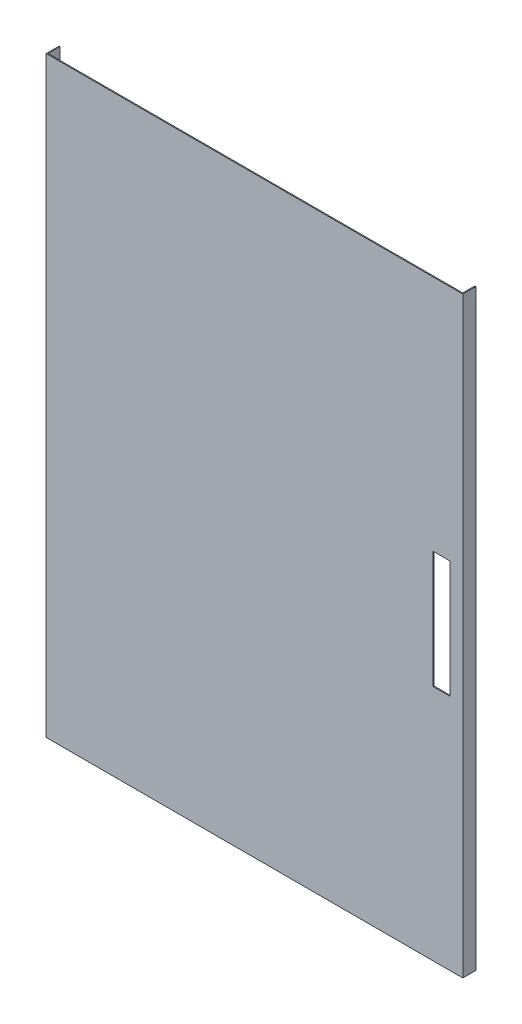
ISO-10303-21;
HEADER;
FILE_DESCRIPTION(('STEP AP214'),'2;1');
FILE_NAME('part.step','',(''),(''),'','','');
FILE_SCHEMA(('AUTOMOTIVE_DESIGN { 1 0 10303 214 1 1 1 1 }'));
ENDSEC;
DATA;
#1=APPLICATION_CONTEXT('core data for automotive mechanical design processes');
#2=APPLICATION_PROTOCOL_DEFINITION('international standard','automotive_design',2000,#1);
#3=PRODUCT_CONTEXT('',#1,'mechanical');
#4=PRODUCT('Part','Part','',(#3));
#5=PRODUCT_RELATED_PRODUCT_CATEGORY('part','',(#4));
#6=PRODUCT_DEFINITION_FORMATION('','',#4);
#7=PRODUCT_DEFINITION_CONTEXT('part definition',#1,'design');
#8=PRODUCT_DEFINITION('design','',#6,#7);
#9=PRODUCT_DEFINITION_SHAPE('','',#8);
#10=(LENGTH_UNIT() NAMED_UNIT(*) SI_UNIT(.MILLI.,.METRE.));
#11=(NAMED_UNIT(*) PLANE_ANGLE_UNIT() SI_UNIT($,.RADIAN.));
#12=(NAMED_UNIT(*) SI_UNIT($,.STERADIAN.) SOLID_ANGLE_UNIT());
#13=UNCERTAINTY_MEASURE_WITH_UNIT(LENGTH_MEASURE(1.E-05),#10,'distance_accuracy_value','');
#14=(GEOMETRIC_REPRESENTATION_CONTEXT(3) GLOBAL_UNCERTAINTY_ASSIGNED_CONTEXT((#13)) GLOBAL_UNIT_ASSIGNED_CONTEXT((#10,
#11,#12)) REPRESENTATION_CONTEXT('',''));
#15=CARTESIAN_POINT('',(0.,0.,0.));
#16=DIRECTION('',(0.,0.,1.));
#17=DIRECTION('',(1.,0.,0.));
#18=AXIS2_PLACEMENT_3D('',#15,#16,#17);
#19=CARTESIAN_POINT('',(670.,1950.,40.));
#20=DIRECTION('',(0.,0.,-1.));
#21=DIRECTION('',(-1.,0.,0.));
#22=AXIS2_PLACEMENT_3D('',#19,#20,#21);
#23=PLANE('',#22);
#24=DIRECTION('',(1.,0.,0.));
#25=VECTOR('',#24,1.);
#26=CARTESIAN_POINT('',(670.,1040.,40.));
#27=LINE('',#26,#25);
#28=CARTESIAN_POINT('',(30.,1040.,40.));
#29=VERTEX_POINT('',#28);
#30=CARTESIAN_POINT('',(670.,1040.,40.));
#31=VERTEX_POINT('',#30);
#32=EDGE_CURVE('E141',#29,#31,#27,.T.);
#33=ORIENTED_EDGE('',*,*,#32,.T.);
#34=DIRECTION('',(0.,-1.,0.));
#35=VECTOR('',#34,1.);
#36=CARTESIAN_POINT('',(670.,1950.,40.));
#37=LINE('',#36,#35);
#38=CARTESIAN_POINT('',(670.,1950.,40.));
#39=VERTEX_POINT('',#38);
#40=EDGE_CURVE('E200',#39,#31,#37,.T.);
#41=ORIENTED_EDGE('',*,*,#40,.F.);
#42=DIRECTION('',(1.,0.,0.));
#43=VECTOR('',#42,1.);
#44=CARTESIAN_POINT('',(670.,1950.,40.));
#45=LINE('',#44,#43);
#46=CARTESIAN_POINT('',(30.,1950.,40.));
#47=VERTEX_POINT('',#46);
#48=EDGE_CURVE('E149',#47,#39,#45,.T.);
#49=ORIENTED_EDGE('',*,*,#48,.F.);
#50=DIRECTION('',(0.,-1.,0.));
#51=VECTOR('',#50,1.);
#52=CARTESIAN_POINT('',(30.,1950.,40.));
#53=LINE('',#52,#51);
#54=EDGE_CURVE('E166',#47,#29,#53,.T.);
#55=ORIENTED_EDGE('',*,*,#54,.T.);
#56=EDGE_LOOP('',(#33,#41,#49,#55));
#57=FACE_BOUND('',#56,.T.);
#58=DIRECTION('',(0.,-1.,0.));
#59=VECTOR('',#58,1.);
#60=CARTESIAN_POINT('',(624.,1950.,40.));
#61=LINE('',#60,#59);
#62=CARTESIAN_POINT('',(624.,1585.,40.));
#63=VERTEX_POINT('',#62);
#64=CARTESIAN_POINT('',(624.,1405.,40.));
#65=VERTEX_POINT('',#64);
#66=EDGE_CURVE('E134',#63,#65,#61,.T.);
#67=ORIENTED_EDGE('',*,*,#66,.F.);
#68=DIRECTION('',(-1.,0.,0.));
#69=VECTOR('',#68,1.);
#70=CARTESIAN_POINT('',(670.,1585.,40.));
#71=LINE('',#70,#69);
#72=CARTESIAN_POINT('',(650.,1585.,40.));
#73=VERTEX_POINT('',#72);
#74=EDGE_CURVE('E123',#73,#63,#71,.T.);
#75=ORIENTED_EDGE('',*,*,#74,.F.);
#76=DIRECTION('',(0.,1.,0.));
#77=VECTOR('',#76,1.);
#78=CARTESIAN_POINT('',(650.,1950.,40.));
#79=LINE('',#78,#77);
#80=CARTESIAN_POINT('',(650.,1405.,40.));
#81=VERTEX_POINT('',#80);
#82=EDGE_CURVE('E128',#81,#73,#79,.T.);
#83=ORIENTED_EDGE('',*,*,#82,.F.);
#84=DIRECTION('',(1.,0.,0.));
#85=VECTOR('',#84,1.);
#86=CARTESIAN_POINT('',(670.,1405.,40.));
#87=LINE('',#86,#85);
#88=EDGE_CURVE('E140',#65,#81,#87,.T.);
#89=ORIENTED_EDGE('',*,*,#88,.F.);
#90=EDGE_LOOP('',(#67,#75,#83,#89));
#91=FACE_BOUND('',#90,.T.);
#92=ADVANCED_FACE('F39',(#57,#91),#23,.F.);
#93=CARTESIAN_POINT('',(31.5,1950.,38.5));
#94=DIRECTION('',(0.,0.,1.));
#95=DIRECTION('',(1.,0.,0.));
#96=AXIS2_PLACEMENT_3D('',#93,#94,#95);
#97=PLANE('',#96);
#98=DIRECTION('',(-1.,0.,0.));
#99=VECTOR('',#98,1.);
#100=CARTESIAN_POINT('',(31.5,1040.,38.5));
#101=LINE('',#100,#99);
#102=CARTESIAN_POINT('',(668.5,1040.,38.5));
#103=VERTEX_POINT('',#102);
#104=CARTESIAN_POINT('',(31.5,1040.,38.5));
#105=VERTEX_POINT('',#104);
#106=EDGE_CURVE('E173',#103,#105,#101,.T.);
#107=ORIENTED_EDGE('',*,*,#106,.T.);
#108=DIRECTION('',(0.,-1.,0.));
#109=VECTOR('',#108,1.);
#110=CARTESIAN_POINT('',(31.5,1950.,38.5));
#111=LINE('',#110,#109);
#112=CARTESIAN_POINT('',(31.5,1950.,38.5));
#113=VERTEX_POINT('',#112);
#114=EDGE_CURVE('E188',#113,#105,#111,.T.);
#115=ORIENTED_EDGE('',*,*,#114,.F.);
#116=DIRECTION('',(-1.,0.,0.));
#117=VECTOR('',#116,1.);
#118=CARTESIAN_POINT('',(31.5,1950.,38.5));
#119=LINE('',#118,#117);
#120=CARTESIAN_POINT('',(668.5,1950.,38.5));
#121=VERTEX_POINT('',#120);
#122=EDGE_CURVE('E159',#121,#113,#119,.T.);
#123=ORIENTED_EDGE('',*,*,#122,.F.);
#124=DIRECTION('',(0.,-1.,0.));
#125=VECTOR('',#124,1.);
#126=CARTESIAN_POINT('',(668.5,1950.,38.5));
#127=LINE('',#126,#125);
#128=EDGE_CURVE('E191',#121,#103,#127,.T.);
#129=ORIENTED_EDGE('',*,*,#128,.T.);
#130=EDGE_LOOP('',(#107,#115,#123,#129));
#131=FACE_BOUND('',#130,.T.);
#132=DIRECTION('',(0.,1.,0.));
#133=VECTOR('',#132,1.);
#134=CARTESIAN_POINT('',(624.,1950.,38.5));
#135=LINE('',#134,#133);
#136=CARTESIAN_POINT('',(624.,1405.,38.5));
#137=VERTEX_POINT('',#136);
#138=CARTESIAN_POINT('',(624.,1585.,38.5));
#139=VERTEX_POINT('',#138);
#140=EDGE_CURVE('E11',#137,#139,#135,.T.);
#141=ORIENTED_EDGE('',*,*,#140,.F.);
#142=DIRECTION('',(-1.,0.,0.));
#143=VECTOR('',#142,1.);
#144=CARTESIAN_POINT('',(31.5,1405.,38.5));
#145=LINE('',#144,#143);
#146=CARTESIAN_POINT('',(650.,1405.,38.5));
#147=VERTEX_POINT('',#146);
#148=EDGE_CURVE('E46',#147,#137,#145,.T.);
#149=ORIENTED_EDGE('',*,*,#148,.F.);
#150=DIRECTION('',(0.,-1.,0.));
#151=VECTOR('',#150,1.);
#152=CARTESIAN_POINT('',(650.,1950.,38.5));
#153=LINE('',#152,#151);
#154=CARTESIAN_POINT('',(650.,1585.,38.5));
#155=VERTEX_POINT('',#154);
#156=EDGE_CURVE('E205',#155,#147,#153,.T.);
#157=ORIENTED_EDGE('',*,*,#156,.F.);
#158=DIRECTION('',(1.,0.,0.));
#159=VECTOR('',#158,1.);
#160=CARTESIAN_POINT('',(31.5,1585.,38.5));
#161=LINE('',#160,#159);
#162=EDGE_CURVE('E203',#139,#155,#161,.T.);
#163=ORIENTED_EDGE('',*,*,#162,.F.);
#164=EDGE_LOOP('',(#141,#149,#157,#163));
#165=FACE_BOUND('',#164,.T.);
#166=ADVANCED_FACE('F215',(#131,#165),#97,.F.);
#167=CARTESIAN_POINT('',(670.,1950.,20.));
#168=DIRECTION('',(-1.,0.,0.));
#169=DIRECTION('',(0.,0.,1.));
#170=AXIS2_PLACEMENT_3D('',#167,#168,#169);
#171=PLANE('',#170);
#172=DIRECTION('',(0.,0.,-1.));
#173=VECTOR('',#172,1.);
#174=CARTESIAN_POINT('',(670.,1040.,20.));
#175=LINE('',#174,#173);
#176=CARTESIAN_POINT('',(670.,1040.,20.));
#177=VERTEX_POINT('',#176);
#178=EDGE_CURVE('E144',#31,#177,#175,.T.);
#179=ORIENTED_EDGE('',*,*,#178,.T.);
#180=DIRECTION('',(0.,-1.,0.));
#181=VECTOR('',#180,1.);
#182=CARTESIAN_POINT('',(670.,1950.,20.));
#183=LINE('',#182,#181);
#184=CARTESIAN_POINT('',(670.,1950.,20.));
#185=VERTEX_POINT('',#184);
#186=EDGE_CURVE('E197',#185,#177,#183,.T.);
#187=ORIENTED_EDGE('',*,*,#186,.F.);
#188=DIRECTION('',(0.,0.,-1.));
#189=VECTOR('',#188,1.);
#190=CARTESIAN_POINT('',(670.,1950.,20.));
#191=LINE('',#190,#189);
#192=EDGE_CURVE('E152',#39,#185,#191,.T.);
#193=ORIENTED_EDGE('',*,*,#192,.F.);
#194=ORIENTED_EDGE('',*,*,#40,.T.);
#195=EDGE_LOOP('',(#179,#187,#193,#194));
#196=FACE_BOUND('',#195,.T.);
#197=ADVANCED_FACE('F234',(#196),#171,.F.);
#198=CARTESIAN_POINT('',(668.5,1950.,20.));
#199=DIRECTION('',(0.,0.,1.));
#200=DIRECTION('',(1.,0.,0.));
#201=AXIS2_PLACEMENT_3D('',#198,#199,#200);
#202=PLANE('',#201);
#203=DIRECTION('',(-1.,0.,0.));
#204=VECTOR('',#203,1.);
#205=CARTESIAN_POINT('',(668.5,1040.,20.));
#206=LINE('',#205,#204);
#207=CARTESIAN_POINT('',(668.5,1040.,20.));
#208=VERTEX_POINT('',#207);
#209=EDGE_CURVE('E169',#177,#208,#206,.T.);
#210=ORIENTED_EDGE('',*,*,#209,.T.);
#211=DIRECTION('',(0.,-1.,0.));
#212=VECTOR('',#211,1.);
#213=CARTESIAN_POINT('',(668.5,1950.,20.));
#214=LINE('',#213,#212);
#215=CARTESIAN_POINT('',(668.5,1950.,20.));
#216=VERTEX_POINT('',#215);
#217=EDGE_CURVE('E194',#216,#208,#214,.T.);
#218=ORIENTED_EDGE('',*,*,#217,.F.);
#219=DIRECTION('',(-1.,0.,0.));
#220=VECTOR('',#219,1.);
#221=CARTESIAN_POINT('',(668.5,1950.,20.));
#222=LINE('',#221,#220);
#223=EDGE_CURVE('E155',#185,#216,#222,.T.);
#224=ORIENTED_EDGE('',*,*,#223,.F.);
#225=ORIENTED_EDGE('',*,*,#186,.T.);
#226=EDGE_LOOP('',(#210,#218,#224,#225));
#227=FACE_BOUND('',#226,.T.);
#228=ADVANCED_FACE('F273',(#227),#202,.F.);
#229=CARTESIAN_POINT('',(668.5,1950.,38.5));
#230=DIRECTION('',(1.,0.,0.));
#231=DIRECTION('',(0.,0.,-1.));
#232=AXIS2_PLACEMENT_3D('',#229,#230,#231);
#233=PLANE('',#232);
#234=DIRECTION('',(0.,0.,1.));
#235=VECTOR('',#234,1.);
#236=CARTESIAN_POINT('',(668.5,1040.,38.5));
#237=LINE('',#236,#235);
#238=EDGE_CURVE('E171',#208,#103,#237,.T.);
#239=ORIENTED_EDGE('',*,*,#238,.T.);
#240=ORIENTED_EDGE('',*,*,#128,.F.);
#241=DIRECTION('',(0.,0.,1.));
#242=VECTOR('',#241,1.);
#243=CARTESIAN_POINT('',(668.5,1950.,38.5));
#244=LINE('',#243,#242);
#245=EDGE_CURVE('E157',#216,#121,#244,.T.);
#246=ORIENTED_EDGE('',*,*,#245,.F.);
#247=ORIENTED_EDGE('',*,*,#217,.T.);
#248=EDGE_LOOP('',(#239,#240,#246,#247));
#249=FACE_BOUND('',#248,.T.);
#250=ADVANCED_FACE('F270',(#249),#233,.F.);
#251=CARTESIAN_POINT('',(31.5,1950.,20.));
#252=DIRECTION('',(-1.,0.,0.));
#253=DIRECTION('',(0.,0.,1.));
#254=AXIS2_PLACEMENT_3D('',#251,#252,#253);
#255=PLANE('',#254);
#256=DIRECTION('',(0.,0.,-1.));
#257=VECTOR('',#256,1.);
#258=CARTESIAN_POINT('',(31.5,1040.,20.));
#259=LINE('',#258,#257);
#260=CARTESIAN_POINT('',(31.5,1040.,20.));
#261=VERTEX_POINT('',#260);
#262=EDGE_CURVE('E175',#105,#261,#259,.T.);
#263=ORIENTED_EDGE('',*,*,#262,.T.);
#264=DIRECTION('',(0.,-1.,0.));
#265=VECTOR('',#264,1.);
#266=CARTESIAN_POINT('',(31.5,1950.,20.));
#267=LINE('',#266,#265);
#268=CARTESIAN_POINT('',(31.5,1950.,20.));
#269=VERTEX_POINT('',#268);
#270=EDGE_CURVE('E185',#269,#261,#267,.T.);
#271=ORIENTED_EDGE('',*,*,#270,.F.);
#272=DIRECTION('',(0.,0.,-1.));
#273=VECTOR('',#272,1.);
#274=CARTESIAN_POINT('',(31.5,1950.,20.));
#275=LINE('',#274,#273);
#276=EDGE_CURVE('E161',#113,#269,#275,.T.);
#277=ORIENTED_EDGE('',*,*,#276,.F.);
#278=ORIENTED_EDGE('',*,*,#114,.T.);
#279=EDGE_LOOP('',(#263,#271,#277,#278));
#280=FACE_BOUND('',#279,.T.);
#281=ADVANCED_FACE('F263',(#280),#255,.F.);
#282=CARTESIAN_POINT('',(30.,1950.,20.));
#283=DIRECTION('',(0.,0.,1.));
#284=DIRECTION('',(1.,0.,0.));
#285=AXIS2_PLACEMENT_3D('',#282,#283,#284);
#286=PLANE('',#285);
#287=DIRECTION('',(-1.,0.,0.));
#288=VECTOR('',#287,1.);
#289=CARTESIAN_POINT('',(30.,1040.,20.));
#290=LINE('',#289,#288);
#291=CARTESIAN_POINT('',(30.,1040.,20.));
#292=VERTEX_POINT('',#291);
#293=EDGE_CURVE('E177',#261,#292,#290,.T.);
#294=ORIENTED_EDGE('',*,*,#293,.T.);
#295=DIRECTION('',(0.,-1.,0.));
#296=VECTOR('',#295,1.);
#297=CARTESIAN_POINT('',(30.,1950.,20.));
#298=LINE('',#297,#296);
#299=CARTESIAN_POINT('',(30.,1950.,20.));
#300=VERTEX_POINT('',#299);
#301=EDGE_CURVE('E182',#300,#292,#298,.T.);
#302=ORIENTED_EDGE('',*,*,#301,.F.);
#303=DIRECTION('',(-1.,0.,0.));
#304=VECTOR('',#303,1.);
#305=CARTESIAN_POINT('',(30.,1950.,20.));
#306=LINE('',#305,#304);
#307=EDGE_CURVE('E163',#269,#300,#306,.T.);
#308=ORIENTED_EDGE('',*,*,#307,.F.);
#309=ORIENTED_EDGE('',*,*,#270,.T.);
#310=EDGE_LOOP('',(#294,#302,#308,#309));
#311=FACE_BOUND('',#310,.T.);
#312=ADVANCED_FACE('F258',(#311),#286,.F.);
#313=CARTESIAN_POINT('',(30.,1950.,40.));
#314=DIRECTION('',(1.,0.,0.));
#315=DIRECTION('',(0.,0.,-1.));
#316=AXIS2_PLACEMENT_3D('',#313,#314,#315);
#317=PLANE('',#316);
#318=DIRECTION('',(0.,0.,1.));
#319=VECTOR('',#318,1.);
#320=CARTESIAN_POINT('',(30.,1040.,40.));
#321=LINE('',#320,#319);
#322=EDGE_CURVE('E153',#292,#29,#321,.T.);
#323=ORIENTED_EDGE('',*,*,#322,.T.);
#324=ORIENTED_EDGE('',*,*,#54,.F.);
#325=DIRECTION('',(0.,0.,1.));
#326=VECTOR('',#325,1.);
#327=CARTESIAN_POINT('',(30.,1950.,40.));
#328=LINE('',#327,#326);
#329=EDGE_CURVE('E165',#300,#47,#328,.T.);
#330=ORIENTED_EDGE('',*,*,#329,.F.);
#331=ORIENTED_EDGE('',*,*,#301,.T.);
#332=EDGE_LOOP('',(#323,#324,#330,#331));
#333=FACE_BOUND('',#332,.T.);
#334=ADVANCED_FACE('F256',(#333),#317,.F.);
#335=CARTESIAN_POINT('',(0.,1950.,0.));
#336=DIRECTION('',(0.,-1.,0.));
#337=DIRECTION('',(0.,0.,-1.));
#338=AXIS2_PLACEMENT_3D('',#335,#336,#337);
#339=PLANE('',#338);
#340=ORIENTED_EDGE('',*,*,#48,.T.);
#341=ORIENTED_EDGE('',*,*,#192,.T.);
#342=ORIENTED_EDGE('',*,*,#223,.T.);
#343=ORIENTED_EDGE('',*,*,#245,.T.);
#344=ORIENTED_EDGE('',*,*,#122,.T.);
#345=ORIENTED_EDGE('',*,*,#276,.T.);
#346=ORIENTED_EDGE('',*,*,#307,.T.);
#347=ORIENTED_EDGE('',*,*,#329,.T.);
#348=EDGE_LOOP('',(#340,#341,#342,#343,#344,#345,#346,#347));
#349=FACE_BOUND('',#348,.T.);
#350=ADVANCED_FACE('F251',(#349),#339,.F.);
#351=CARTESIAN_POINT('',(0.,1040.,0.));
#352=DIRECTION('',(0.,-1.,0.));
#353=DIRECTION('',(0.,0.,-1.));
#354=AXIS2_PLACEMENT_3D('',#351,#352,#353);
#355=PLANE('',#354);
#356=ORIENTED_EDGE('',*,*,#32,.F.);
#357=ORIENTED_EDGE('',*,*,#322,.F.);
#358=ORIENTED_EDGE('',*,*,#293,.F.);
#359=ORIENTED_EDGE('',*,*,#262,.F.);
#360=ORIENTED_EDGE('',*,*,#106,.F.);
#361=ORIENTED_EDGE('',*,*,#238,.F.);
#362=ORIENTED_EDGE('',*,*,#209,.F.);
#363=ORIENTED_EDGE('',*,*,#178,.F.);
#364=EDGE_LOOP('',(#356,#357,#358,#359,#360,#361,#362,#363));
#365=FACE_BOUND('',#364,.T.);
#366=ADVANCED_FACE('F243',(#365),#355,.T.);
#367=CARTESIAN_POINT('',(624.,1405.,41.));
#368=DIRECTION('',(1.,0.,0.));
#369=DIRECTION('',(0.,0.,-1.));
#370=AXIS2_PLACEMENT_3D('',#367,#368,#369);
#371=PLANE('',#370);
#372=ORIENTED_EDGE('',*,*,#66,.T.);
#373=DIRECTION('',(0.,0.,-1.));
#374=VECTOR('',#373,1.);
#375=CARTESIAN_POINT('',(624.,1405.,41.));
#376=LINE('',#375,#374);
#377=EDGE_CURVE('E129',#65,#137,#376,.T.);
#378=ORIENTED_EDGE('',*,*,#377,.T.);
#379=ORIENTED_EDGE('',*,*,#140,.T.);
#380=DIRECTION('',(0.,0.,-1.));
#381=VECTOR('',#380,1.);
#382=CARTESIAN_POINT('',(624.,1585.,41.));
#383=LINE('',#382,#381);
#384=EDGE_CURVE('E58',#63,#139,#383,.T.);
#385=ORIENTED_EDGE('',*,*,#384,.F.);
#386=EDGE_LOOP('',(#372,#378,#379,#385));
#387=FACE_BOUND('',#386,.T.);
#388=ADVANCED_FACE('F132',(#387),#371,.T.);
#389=CARTESIAN_POINT('',(624.,1405.,41.));
#390=DIRECTION('',(0.,1.,0.));
#391=DIRECTION('',(0.,0.,1.));
#392=AXIS2_PLACEMENT_3D('',#389,#390,#391);
#393=PLANE('',#392);
#394=ORIENTED_EDGE('',*,*,#88,.T.);
#395=DIRECTION('',(0.,0.,-1.));
#396=VECTOR('',#395,1.);
#397=CARTESIAN_POINT('',(650.,1405.,41.));
#398=LINE('',#397,#396);
#399=EDGE_CURVE('E211',#81,#147,#398,.T.);
#400=ORIENTED_EDGE('',*,*,#399,.T.);
#401=ORIENTED_EDGE('',*,*,#148,.T.);
#402=ORIENTED_EDGE('',*,*,#377,.F.);
#403=EDGE_LOOP('',(#394,#400,#401,#402));
#404=FACE_BOUND('',#403,.T.);
#405=ADVANCED_FACE('F209',(#404),#393,.T.);
#406=CARTESIAN_POINT('',(650.,1405.,41.));
#407=DIRECTION('',(-1.,0.,0.));
#408=DIRECTION('',(0.,0.,1.));
#409=AXIS2_PLACEMENT_3D('',#406,#407,#408);
#410=PLANE('',#409);
#411=ORIENTED_EDGE('',*,*,#82,.T.);
#412=DIRECTION('',(0.,0.,-1.));
#413=VECTOR('',#412,1.);
#414=CARTESIAN_POINT('',(650.,1585.,41.));
#415=LINE('',#414,#413);
#416=EDGE_CURVE('E53',#73,#155,#415,.T.);
#417=ORIENTED_EDGE('',*,*,#416,.T.);
#418=ORIENTED_EDGE('',*,*,#156,.T.);
#419=ORIENTED_EDGE('',*,*,#399,.F.);
#420=EDGE_LOOP('',(#411,#417,#418,#419));
#421=FACE_BOUND('',#420,.T.);
#422=ADVANCED_FACE('F217',(#421),#410,.T.);
#423=CARTESIAN_POINT('',(624.,1585.,41.));
#424=DIRECTION('',(0.,-1.,0.));
#425=DIRECTION('',(0.,0.,-1.));
#426=AXIS2_PLACEMENT_3D('',#423,#424,#425);
#427=PLANE('',#426);
#428=ORIENTED_EDGE('',*,*,#74,.T.);
#429=ORIENTED_EDGE('',*,*,#384,.T.);
#430=ORIENTED_EDGE('',*,*,#162,.T.);
#431=ORIENTED_EDGE('',*,*,#416,.F.);
#432=EDGE_LOOP('',(#428,#429,#430,#431));
#433=FACE_BOUND('',#432,.T.);
#434=ADVANCED_FACE('F124',(#433),#427,.T.);
#435=CLOSED_SHELL('',(#92,#166,#197,#228,#250,#281,#312,#334,#350,#366,#388,#405,#422,#434));
#436=MANIFOLD_SOLID_BREP('B2',#435);
#437=ADVANCED_BREP_SHAPE_REPRESENTATION('',(#18,#436),#14);
#438=SHAPE_DEFINITION_REPRESENTATION(#9,#437);
ENDSEC;
END-ISO-10303-21;
